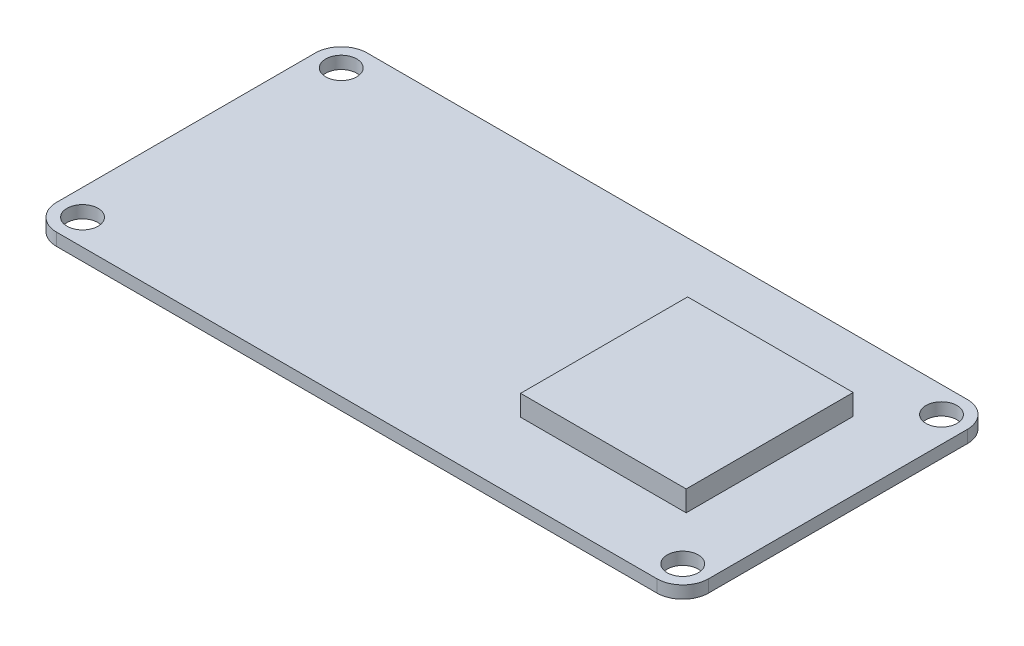
ISO-10303-21;
HEADER;
FILE_DESCRIPTION(('STEP AP214'),'2;1');
FILE_NAME('part.step','',(''),(''),'','','');
FILE_SCHEMA(('AUTOMOTIVE_DESIGN { 1 0 10303 214 1 1 1 1 }'));
ENDSEC;
DATA;
#1=APPLICATION_CONTEXT('core data for automotive mechanical design processes');
#2=APPLICATION_PROTOCOL_DEFINITION('international standard','automotive_design',2000,#1);
#3=PRODUCT_CONTEXT('',#1,'mechanical');
#4=PRODUCT('Part','Part','',(#3));
#5=PRODUCT_RELATED_PRODUCT_CATEGORY('part','',(#4));
#6=PRODUCT_DEFINITION_FORMATION('','',#4);
#7=PRODUCT_DEFINITION_CONTEXT('part definition',#1,'design');
#8=PRODUCT_DEFINITION('design','',#6,#7);
#9=PRODUCT_DEFINITION_SHAPE('','',#8);
#10=(LENGTH_UNIT() NAMED_UNIT(*) SI_UNIT(.MILLI.,.METRE.));
#11=(NAMED_UNIT(*) PLANE_ANGLE_UNIT() SI_UNIT($,.RADIAN.));
#12=(NAMED_UNIT(*) SI_UNIT($,.STERADIAN.) SOLID_ANGLE_UNIT());
#13=UNCERTAINTY_MEASURE_WITH_UNIT(LENGTH_MEASURE(1.E-05),#10,'distance_accuracy_value','');
#14=(GEOMETRIC_REPRESENTATION_CONTEXT(3) GLOBAL_UNCERTAINTY_ASSIGNED_CONTEXT((#13)) GLOBAL_UNIT_ASSIGNED_CONTEXT((#10,
#11,#12)) REPRESENTATION_CONTEXT('',''));
#15=CARTESIAN_POINT('',(0.,0.,0.));
#16=DIRECTION('',(0.,0.,1.));
#17=DIRECTION('',(1.,0.,0.));
#18=AXIS2_PLACEMENT_3D('',#15,#16,#17);
#19=CARTESIAN_POINT('',(0.,1.2,0.));
#20=DIRECTION('',(0.,1.,0.));
#21=DIRECTION('',(0.,0.,1.));
#22=AXIS2_PLACEMENT_3D('',#19,#20,#21);
#23=PLANE('',#22);
#24=DIRECTION('',(0.,0.,1.));
#25=VECTOR('',#24,1.);
#26=CARTESIAN_POINT('',(11.3272410214425,1.2,-6.75742722107556));
#27=LINE('',#26,#25);
#28=CARTESIAN_POINT('',(11.3272410214425,1.2,-6.75742722107556));
#29=VERTEX_POINT('',#28);
#30=CARTESIAN_POINT('',(11.3272410214425,1.2,9.38275914708948));
#31=VERTEX_POINT('',#30);
#32=EDGE_CURVE('E60',#29,#31,#27,.T.);
#33=ORIENTED_EDGE('',*,*,#32,.F.);
#34=DIRECTION('',(-1.,0.,0.));
#35=VECTOR('',#34,1.);
#36=CARTESIAN_POINT('',(11.3272410214425,1.2,-6.75742722107556));
#37=LINE('',#36,#35);
#38=CARTESIAN_POINT('',(27.3272410214425,1.2,-6.75742722107556));
#39=VERTEX_POINT('',#38);
#40=EDGE_CURVE('E64',#39,#29,#37,.T.);
#41=ORIENTED_EDGE('',*,*,#40,.F.);
#42=DIRECTION('',(0.,0.,-1.));
#43=VECTOR('',#42,1.);
#44=CARTESIAN_POINT('',(27.3272410214425,1.2,-6.75742722107556));
#45=LINE('',#44,#43);
#46=CARTESIAN_POINT('',(27.3272410214425,1.2,9.38275914708948));
#47=VERTEX_POINT('',#46);
#48=EDGE_CURVE('E550',#47,#39,#45,.T.);
#49=ORIENTED_EDGE('',*,*,#48,.F.);
#50=DIRECTION('',(1.,0.,0.));
#51=VECTOR('',#50,1.);
#52=CARTESIAN_POINT('',(11.3272410214425,1.2,9.38275914708948));
#53=LINE('',#52,#51);
#54=EDGE_CURVE('E556',#31,#47,#53,.T.);
#55=ORIENTED_EDGE('',*,*,#54,.F.);
#56=EDGE_LOOP('',(#33,#41,#49,#55));
#57=FACE_BOUND('',#56,.T.);
#58=CARTESIAN_POINT('',(31.4272410214425,1.2,13.812665963007));
#59=DIRECTION('',(0.,1.,0.));
#60=DIRECTION('',(0.,0.,1.));
#61=AXIS2_PLACEMENT_3D('',#58,#59,#60);
#62=CIRCLE('',#61,1.5);
#63=CARTESIAN_POINT('',(31.4272410214425,1.2,15.312665963007));
#64=VERTEX_POINT('',#63);
#65=EDGE_CURVE('E165',#64,#64,#62,.T.);
#66=ORIENTED_EDGE('',*,*,#65,.F.);
#67=EDGE_LOOP('',(#66));
#68=FACE_BOUND('',#67,.T.);
#69=CARTESIAN_POINT('',(-26.5727589785575,1.2,-11.187334036993));
#70=DIRECTION('',(0.,1.,0.));
#71=DIRECTION('',(0.,0.,1.));
#72=AXIS2_PLACEMENT_3D('',#69,#70,#71);
#73=CIRCLE('',#72,1.5);
#74=CARTESIAN_POINT('',(-26.5727589785575,1.2,-9.68733403699303));
#75=VERTEX_POINT('',#74);
#76=EDGE_CURVE('E177',#75,#75,#73,.T.);
#77=ORIENTED_EDGE('',*,*,#76,.F.);
#78=EDGE_LOOP('',(#77));
#79=FACE_BOUND('',#78,.T.);
#80=DIRECTION('',(0.,0.,-1.));
#81=VECTOR('',#80,1.);
#82=CARTESIAN_POINT('',(33.9272410214425,1.2,-13.687334036993));
#83=LINE('',#82,#81);
#84=CARTESIAN_POINT('',(33.9272410214425,1.2,13.812665963007));
#85=VERTEX_POINT('',#84);
#86=CARTESIAN_POINT('',(33.9272410214425,1.2,-11.187334036993));
#87=VERTEX_POINT('',#86);
#88=EDGE_CURVE('E190',#85,#87,#83,.T.);
#89=ORIENTED_EDGE('',*,*,#88,.T.);
#90=CARTESIAN_POINT('',(31.4272410214425,1.2,-11.187334036993));
#91=DIRECTION('',(0.,1.,0.));
#92=DIRECTION('',(0.,0.,1.));
#93=AXIS2_PLACEMENT_3D('',#90,#91,#92);
#94=CIRCLE('',#93,2.5);
#95=CARTESIAN_POINT('',(31.4272410214425,1.2,-13.687334036993));
#96=VERTEX_POINT('',#95);
#97=EDGE_CURVE('E230',#87,#96,#94,.T.);
#98=ORIENTED_EDGE('',*,*,#97,.T.);
#99=DIRECTION('',(-1.,0.,0.));
#100=VECTOR('',#99,1.);
#101=CARTESIAN_POINT('',(-29.0727589785575,1.2,-13.687334036993));
#102=LINE('',#101,#100);
#103=CARTESIAN_POINT('',(-26.5727589785575,1.2,-13.687334036993));
#104=VERTEX_POINT('',#103);
#105=EDGE_CURVE('E193',#96,#104,#102,.T.);
#106=ORIENTED_EDGE('',*,*,#105,.T.);
#107=CARTESIAN_POINT('',(-26.5727589785575,1.2,-11.187334036993));
#108=DIRECTION('',(0.,1.,0.));
#109=DIRECTION('',(0.,0.,1.));
#110=AXIS2_PLACEMENT_3D('',#107,#108,#109);
#111=CIRCLE('',#110,2.5);
#112=CARTESIAN_POINT('',(-29.0727589785575,1.2,-11.187334036993));
#113=VERTEX_POINT('',#112);
#114=EDGE_CURVE('E224',#104,#113,#111,.T.);
#115=ORIENTED_EDGE('',*,*,#114,.T.);
#116=DIRECTION('',(0.,0.,1.));
#117=VECTOR('',#116,1.);
#118=CARTESIAN_POINT('',(-29.0727589785575,1.2,-13.687334036993));
#119=LINE('',#118,#117);
#120=CARTESIAN_POINT('',(-29.0727589785575,1.2,13.812665963007));
#121=VERTEX_POINT('',#120);
#122=EDGE_CURVE('E183',#113,#121,#119,.T.);
#123=ORIENTED_EDGE('',*,*,#122,.T.);
#124=CARTESIAN_POINT('',(-26.5727589785575,1.2,13.812665963007));
#125=DIRECTION('',(0.,1.,0.));
#126=DIRECTION('',(0.,0.,1.));
#127=AXIS2_PLACEMENT_3D('',#124,#125,#126);
#128=CIRCLE('',#127,2.5);
#129=CARTESIAN_POINT('',(-26.5727589785575,1.2,16.312665963007));
#130=VERTEX_POINT('',#129);
#131=EDGE_CURVE('E226',#121,#130,#128,.T.);
#132=ORIENTED_EDGE('',*,*,#131,.T.);
#133=DIRECTION('',(1.,0.,0.));
#134=VECTOR('',#133,1.);
#135=CARTESIAN_POINT('',(-29.0727589785575,1.2,16.312665963007));
#136=LINE('',#135,#134);
#137=CARTESIAN_POINT('',(31.4272410214425,1.2,16.312665963007));
#138=VERTEX_POINT('',#137);
#139=EDGE_CURVE('E186',#130,#138,#136,.T.);
#140=ORIENTED_EDGE('',*,*,#139,.T.);
#141=CARTESIAN_POINT('',(31.4272410214425,1.2,13.812665963007));
#142=DIRECTION('',(0.,1.,0.));
#143=DIRECTION('',(0.,0.,1.));
#144=AXIS2_PLACEMENT_3D('',#141,#142,#143);
#145=CIRCLE('',#144,2.5);
#146=EDGE_CURVE('E228',#138,#85,#145,.T.);
#147=ORIENTED_EDGE('',*,*,#146,.T.);
#148=EDGE_LOOP('',(#89,#98,#106,#115,#123,#132,#140,#147));
#149=FACE_BOUND('',#148,.T.);
#150=CARTESIAN_POINT('',(-26.5727589785575,1.2,13.812665963007));
#151=DIRECTION('',(0.,1.,0.));
#152=DIRECTION('',(0.,0.,1.));
#153=AXIS2_PLACEMENT_3D('',#150,#151,#152);
#154=CIRCLE('',#153,1.5);
#155=CARTESIAN_POINT('',(-26.5727589785575,1.2,15.312665963007));
#156=VERTEX_POINT('',#155);
#157=EDGE_CURVE('E171',#156,#156,#154,.T.);
#158=ORIENTED_EDGE('',*,*,#157,.F.);
#159=EDGE_LOOP('',(#158));
#160=FACE_BOUND('',#159,.T.);
#161=CARTESIAN_POINT('',(31.4272410214425,1.2,-11.187334036993));
#162=DIRECTION('',(0.,1.,0.));
#163=DIRECTION('',(0.,0.,1.));
#164=AXIS2_PLACEMENT_3D('',#161,#162,#163);
#165=CIRCLE('',#164,1.5);
#166=CARTESIAN_POINT('',(31.4272410214425,1.2,-9.68733403699303));
#167=VERTEX_POINT('',#166);
#168=EDGE_CURVE('E156',#167,#167,#165,.T.);
#169=ORIENTED_EDGE('',*,*,#168,.F.);
#170=EDGE_LOOP('',(#169));
#171=FACE_BOUND('',#170,.T.);
#172=ADVANCED_FACE('F45',(#57,#68,#79,#149,#160,#171),#23,.T.);
#173=CARTESIAN_POINT('',(0.,0.,0.));
#174=DIRECTION('',(0.,1.,0.));
#175=DIRECTION('',(0.,0.,1.));
#176=AXIS2_PLACEMENT_3D('',#173,#174,#175);
#177=PLANE('',#176);
#178=DIRECTION('',(-1.,0.,0.));
#179=VECTOR('',#178,1.);
#180=CARTESIAN_POINT('',(-29.0727589785575,0.,-13.687334036993));
#181=LINE('',#180,#179);
#182=CARTESIAN_POINT('',(31.4272410214425,0.,-13.687334036993));
#183=VERTEX_POINT('',#182);
#184=CARTESIAN_POINT('',(-26.5727589785575,0.,-13.687334036993));
#185=VERTEX_POINT('',#184);
#186=EDGE_CURVE('E187',#183,#185,#181,.T.);
#187=ORIENTED_EDGE('',*,*,#186,.F.);
#188=CARTESIAN_POINT('',(31.4272410214425,0.,-11.187334036993));
#189=DIRECTION('',(0.,1.,0.));
#190=DIRECTION('',(0.,0.,1.));
#191=AXIS2_PLACEMENT_3D('',#188,#189,#190);
#192=CIRCLE('',#191,2.5);
#193=CARTESIAN_POINT('',(33.9272410214425,0.,-11.187334036993));
#194=VERTEX_POINT('',#193);
#195=EDGE_CURVE('E217',#183,#194,#192,.F.);
#196=ORIENTED_EDGE('',*,*,#195,.T.);
#197=DIRECTION('',(0.,0.,-1.));
#198=VECTOR('',#197,1.);
#199=CARTESIAN_POINT('',(33.9272410214425,0.,-13.687334036993));
#200=LINE('',#199,#198);
#201=CARTESIAN_POINT('',(33.9272410214425,0.,13.812665963007));
#202=VERTEX_POINT('',#201);
#203=EDGE_CURVE('E202',#202,#194,#200,.T.);
#204=ORIENTED_EDGE('',*,*,#203,.F.);
#205=CARTESIAN_POINT('',(31.4272410214425,0.,13.812665963007));
#206=DIRECTION('',(0.,1.,0.));
#207=DIRECTION('',(0.,0.,1.));
#208=AXIS2_PLACEMENT_3D('',#205,#206,#207);
#209=CIRCLE('',#208,2.5);
#210=CARTESIAN_POINT('',(31.4272410214425,0.,16.312665963007));
#211=VERTEX_POINT('',#210);
#212=EDGE_CURVE('E215',#202,#211,#209,.F.);
#213=ORIENTED_EDGE('',*,*,#212,.T.);
#214=DIRECTION('',(1.,0.,0.));
#215=VECTOR('',#214,1.);
#216=CARTESIAN_POINT('',(-29.0727589785575,0.,16.312665963007));
#217=LINE('',#216,#215);
#218=CARTESIAN_POINT('',(-26.5727589785575,0.,16.312665963007));
#219=VERTEX_POINT('',#218);
#220=EDGE_CURVE('E199',#219,#211,#217,.T.);
#221=ORIENTED_EDGE('',*,*,#220,.F.);
#222=CARTESIAN_POINT('',(-26.5727589785575,0.,13.812665963007));
#223=DIRECTION('',(0.,1.,0.));
#224=DIRECTION('',(0.,0.,1.));
#225=AXIS2_PLACEMENT_3D('',#222,#223,#224);
#226=CIRCLE('',#225,2.5);
#227=CARTESIAN_POINT('',(-29.0727589785575,0.,13.812665963007));
#228=VERTEX_POINT('',#227);
#229=EDGE_CURVE('E213',#219,#228,#226,.F.);
#230=ORIENTED_EDGE('',*,*,#229,.T.);
#231=DIRECTION('',(0.,0.,1.));
#232=VECTOR('',#231,1.);
#233=CARTESIAN_POINT('',(-29.0727589785575,0.,-13.687334036993));
#234=LINE('',#233,#232);
#235=CARTESIAN_POINT('',(-29.0727589785575,0.,-11.187334036993));
#236=VERTEX_POINT('',#235);
#237=EDGE_CURVE('E180',#236,#228,#234,.T.);
#238=ORIENTED_EDGE('',*,*,#237,.F.);
#239=CARTESIAN_POINT('',(-26.5727589785575,0.,-11.187334036993));
#240=DIRECTION('',(0.,1.,0.));
#241=DIRECTION('',(0.,0.,1.));
#242=AXIS2_PLACEMENT_3D('',#239,#240,#241);
#243=CIRCLE('',#242,2.5);
#244=EDGE_CURVE('E211',#236,#185,#243,.F.);
#245=ORIENTED_EDGE('',*,*,#244,.T.);
#246=EDGE_LOOP('',(#187,#196,#204,#213,#221,#230,#238,#245));
#247=FACE_BOUND('',#246,.T.);
#248=CARTESIAN_POINT('',(-26.5727589785575,0.,-11.187334036993));
#249=DIRECTION('',(0.,1.,0.));
#250=DIRECTION('',(0.,0.,1.));
#251=AXIS2_PLACEMENT_3D('',#248,#249,#250);
#252=CIRCLE('',#251,1.5);
#253=CARTESIAN_POINT('',(-26.5727589785575,0.,-9.68733403699303));
#254=VERTEX_POINT('',#253);
#255=EDGE_CURVE('E174',#254,#254,#252,.T.);
#256=ORIENTED_EDGE('',*,*,#255,.T.);
#257=EDGE_LOOP('',(#256));
#258=FACE_BOUND('',#257,.T.);
#259=CARTESIAN_POINT('',(-26.5727589785575,0.,13.812665963007));
#260=DIRECTION('',(0.,1.,0.));
#261=DIRECTION('',(0.,0.,1.));
#262=AXIS2_PLACEMENT_3D('',#259,#260,#261);
#263=CIRCLE('',#262,1.5);
#264=CARTESIAN_POINT('',(-26.5727589785575,0.,15.312665963007));
#265=VERTEX_POINT('',#264);
#266=EDGE_CURVE('E168',#265,#265,#263,.T.);
#267=ORIENTED_EDGE('',*,*,#266,.T.);
#268=EDGE_LOOP('',(#267));
#269=FACE_BOUND('',#268,.T.);
#270=CARTESIAN_POINT('',(31.4272410214425,0.,13.812665963007));
#271=DIRECTION('',(0.,1.,0.));
#272=DIRECTION('',(0.,0.,1.));
#273=AXIS2_PLACEMENT_3D('',#270,#271,#272);
#274=CIRCLE('',#273,1.5);
#275=CARTESIAN_POINT('',(31.4272410214425,0.,15.312665963007));
#276=VERTEX_POINT('',#275);
#277=EDGE_CURVE('E163',#276,#276,#274,.T.);
#278=ORIENTED_EDGE('',*,*,#277,.T.);
#279=EDGE_LOOP('',(#278));
#280=FACE_BOUND('',#279,.T.);
#281=CARTESIAN_POINT('',(31.4272410214425,0.,-11.187334036993));
#282=DIRECTION('',(0.,1.,0.));
#283=DIRECTION('',(0.,0.,1.));
#284=AXIS2_PLACEMENT_3D('',#281,#282,#283);
#285=CIRCLE('',#284,1.5);
#286=CARTESIAN_POINT('',(31.4272410214425,0.,-9.68733403699303));
#287=VERTEX_POINT('',#286);
#288=EDGE_CURVE('E153',#287,#287,#285,.T.);
#289=ORIENTED_EDGE('',*,*,#288,.T.);
#290=EDGE_LOOP('',(#289));
#291=FACE_BOUND('',#290,.T.);
#292=ADVANCED_FACE('F247',(#247,#258,#269,#280,#291),#177,.F.);
#293=CARTESIAN_POINT('',(-29.0727589785575,1.2,-13.687334036993));
#294=DIRECTION('',(1.,0.,0.));
#295=DIRECTION('',(0.,0.,-1.));
#296=AXIS2_PLACEMENT_3D('',#293,#294,#295);
#297=PLANE('',#296);
#298=ORIENTED_EDGE('',*,*,#237,.T.);
#299=DIRECTION('',(0.,-1.,0.));
#300=VECTOR('',#299,1.);
#301=CARTESIAN_POINT('',(-29.0727589785575,1.2,13.812665963007));
#302=LINE('',#301,#300);
#303=EDGE_CURVE('E11',#228,#121,#302,.F.);
#304=ORIENTED_EDGE('',*,*,#303,.T.);
#305=ORIENTED_EDGE('',*,*,#122,.F.);
#306=DIRECTION('',(0.,-1.,0.));
#307=VECTOR('',#306,1.);
#308=CARTESIAN_POINT('',(-29.0727589785575,1.2,-11.187334036993));
#309=LINE('',#308,#307);
#310=EDGE_CURVE('E53',#113,#236,#309,.T.);
#311=ORIENTED_EDGE('',*,*,#310,.T.);
#312=EDGE_LOOP('',(#298,#304,#305,#311));
#313=FACE_BOUND('',#312,.T.);
#314=ADVANCED_FACE('F241',(#313),#297,.F.);
#315=CARTESIAN_POINT('',(-29.0727589785575,1.2,16.312665963007));
#316=DIRECTION('',(0.,0.,-1.));
#317=DIRECTION('',(-1.,0.,0.));
#318=AXIS2_PLACEMENT_3D('',#315,#316,#317);
#319=PLANE('',#318);
#320=ORIENTED_EDGE('',*,*,#220,.T.);
#321=DIRECTION('',(0.,-1.,0.));
#322=VECTOR('',#321,1.);
#323=CARTESIAN_POINT('',(31.4272410214425,1.2,16.312665963007));
#324=LINE('',#323,#322);
#325=EDGE_CURVE('E235',#211,#138,#324,.F.);
#326=ORIENTED_EDGE('',*,*,#325,.T.);
#327=ORIENTED_EDGE('',*,*,#139,.F.);
#328=DIRECTION('',(0.,-1.,0.));
#329=VECTOR('',#328,1.);
#330=CARTESIAN_POINT('',(-26.5727589785575,1.2,16.312665963007));
#331=LINE('',#330,#329);
#332=EDGE_CURVE('E232',#130,#219,#331,.T.);
#333=ORIENTED_EDGE('',*,*,#332,.T.);
#334=EDGE_LOOP('',(#320,#326,#327,#333));
#335=FACE_BOUND('',#334,.T.);
#336=ADVANCED_FACE('F256',(#335),#319,.F.);
#337=CARTESIAN_POINT('',(33.9272410214425,1.2,-13.687334036993));
#338=DIRECTION('',(-1.,0.,0.));
#339=DIRECTION('',(0.,0.,1.));
#340=AXIS2_PLACEMENT_3D('',#337,#338,#339);
#341=PLANE('',#340);
#342=ORIENTED_EDGE('',*,*,#203,.T.);
#343=DIRECTION('',(0.,-1.,0.));
#344=VECTOR('',#343,1.);
#345=CARTESIAN_POINT('',(33.9272410214425,1.2,-11.187334036993));
#346=LINE('',#345,#344);
#347=EDGE_CURVE('E222',#194,#87,#346,.F.);
#348=ORIENTED_EDGE('',*,*,#347,.T.);
#349=ORIENTED_EDGE('',*,*,#88,.F.);
#350=DIRECTION('',(0.,-1.,0.));
#351=VECTOR('',#350,1.);
#352=CARTESIAN_POINT('',(33.9272410214425,1.2,13.812665963007));
#353=LINE('',#352,#351);
#354=EDGE_CURVE('E219',#85,#202,#353,.T.);
#355=ORIENTED_EDGE('',*,*,#354,.T.);
#356=EDGE_LOOP('',(#342,#348,#349,#355));
#357=FACE_BOUND('',#356,.T.);
#358=ADVANCED_FACE('F267',(#357),#341,.F.);
#359=CARTESIAN_POINT('',(-29.0727589785575,1.2,-13.687334036993));
#360=DIRECTION('',(0.,0.,1.));
#361=DIRECTION('',(1.,0.,0.));
#362=AXIS2_PLACEMENT_3D('',#359,#360,#361);
#363=PLANE('',#362);
#364=ORIENTED_EDGE('',*,*,#105,.F.);
#365=DIRECTION('',(0.,-1.,0.));
#366=VECTOR('',#365,1.);
#367=CARTESIAN_POINT('',(31.4272410214425,1.2,-13.687334036993));
#368=LINE('',#367,#366);
#369=EDGE_CURVE('E208',#96,#183,#368,.T.);
#370=ORIENTED_EDGE('',*,*,#369,.T.);
#371=ORIENTED_EDGE('',*,*,#186,.T.);
#372=DIRECTION('',(0.,-1.,0.));
#373=VECTOR('',#372,1.);
#374=CARTESIAN_POINT('',(-26.5727589785575,1.2,-13.687334036993));
#375=LINE('',#374,#373);
#376=EDGE_CURVE('E196',#185,#104,#375,.F.);
#377=ORIENTED_EDGE('',*,*,#376,.T.);
#378=EDGE_LOOP('',(#364,#370,#371,#377));
#379=FACE_BOUND('',#378,.T.);
#380=ADVANCED_FACE('F275',(#379),#363,.F.);
#381=CARTESIAN_POINT('',(-26.5727589785575,1.2,-11.187334036993));
#382=DIRECTION('',(0.,-1.,0.));
#383=DIRECTION('',(0.,0.,-1.));
#384=AXIS2_PLACEMENT_3D('',#381,#382,#383);
#385=CYLINDRICAL_SURFACE('',#384,1.5);
#386=ORIENTED_EDGE('',*,*,#76,.T.);
#387=EDGE_LOOP('',(#386));
#388=FACE_BOUND('',#387,.T.);
#389=ORIENTED_EDGE('',*,*,#255,.F.);
#390=EDGE_LOOP('',(#389));
#391=FACE_BOUND('',#390,.T.);
#392=ADVANCED_FACE('F291',(#388,#391),#385,.F.);
#393=CARTESIAN_POINT('',(-26.5727589785575,1.2,13.812665963007));
#394=DIRECTION('',(0.,-1.,0.));
#395=DIRECTION('',(0.,0.,-1.));
#396=AXIS2_PLACEMENT_3D('',#393,#394,#395);
#397=CYLINDRICAL_SURFACE('',#396,1.5);
#398=ORIENTED_EDGE('',*,*,#157,.T.);
#399=EDGE_LOOP('',(#398));
#400=FACE_BOUND('',#399,.T.);
#401=ORIENTED_EDGE('',*,*,#266,.F.);
#402=EDGE_LOOP('',(#401));
#403=FACE_BOUND('',#402,.T.);
#404=ADVANCED_FACE('F481',(#400,#403),#397,.F.);
#405=CARTESIAN_POINT('',(31.4272410214425,1.2,13.812665963007));
#406=DIRECTION('',(0.,-1.,0.));
#407=DIRECTION('',(0.,0.,-1.));
#408=AXIS2_PLACEMENT_3D('',#405,#406,#407);
#409=CYLINDRICAL_SURFACE('',#408,1.5);
#410=ORIENTED_EDGE('',*,*,#65,.T.);
#411=EDGE_LOOP('',(#410));
#412=FACE_BOUND('',#411,.T.);
#413=ORIENTED_EDGE('',*,*,#277,.F.);
#414=EDGE_LOOP('',(#413));
#415=FACE_BOUND('',#414,.T.);
#416=ADVANCED_FACE('F472',(#412,#415),#409,.F.);
#417=CARTESIAN_POINT('',(31.4272410214425,1.2,-11.187334036993));
#418=DIRECTION('',(0.,-1.,0.));
#419=DIRECTION('',(0.,0.,-1.));
#420=AXIS2_PLACEMENT_3D('',#417,#418,#419);
#421=CYLINDRICAL_SURFACE('',#420,1.5);
#422=ORIENTED_EDGE('',*,*,#168,.T.);
#423=EDGE_LOOP('',(#422));
#424=FACE_BOUND('',#423,.T.);
#425=ORIENTED_EDGE('',*,*,#288,.F.);
#426=EDGE_LOOP('',(#425));
#427=FACE_BOUND('',#426,.T.);
#428=ADVANCED_FACE('F304',(#424,#427),#421,.F.);
#429=CARTESIAN_POINT('',(31.4272410214425,1.2,-11.187334036993));
#430=DIRECTION('',(0.,-1.,0.));
#431=DIRECTION('',(0.,0.,-1.));
#432=AXIS2_PLACEMENT_3D('',#429,#430,#431);
#433=CYLINDRICAL_SURFACE('',#432,2.5);
#434=ORIENTED_EDGE('',*,*,#97,.F.);
#435=ORIENTED_EDGE('',*,*,#347,.F.);
#436=ORIENTED_EDGE('',*,*,#195,.F.);
#437=ORIENTED_EDGE('',*,*,#369,.F.);
#438=EDGE_LOOP('',(#434,#435,#436,#437));
#439=FACE_BOUND('',#438,.T.);
#440=ADVANCED_FACE('F272',(#439),#433,.T.);
#441=CARTESIAN_POINT('',(31.4272410214425,1.2,13.812665963007));
#442=DIRECTION('',(0.,-1.,0.));
#443=DIRECTION('',(0.,0.,-1.));
#444=AXIS2_PLACEMENT_3D('',#441,#442,#443);
#445=CYLINDRICAL_SURFACE('',#444,2.5);
#446=ORIENTED_EDGE('',*,*,#146,.F.);
#447=ORIENTED_EDGE('',*,*,#325,.F.);
#448=ORIENTED_EDGE('',*,*,#212,.F.);
#449=ORIENTED_EDGE('',*,*,#354,.F.);
#450=EDGE_LOOP('',(#446,#447,#448,#449));
#451=FACE_BOUND('',#450,.T.);
#452=ADVANCED_FACE('F264',(#451),#445,.T.);
#453=CARTESIAN_POINT('',(-26.5727589785575,1.2,13.812665963007));
#454=DIRECTION('',(0.,-1.,0.));
#455=DIRECTION('',(0.,0.,-1.));
#456=AXIS2_PLACEMENT_3D('',#453,#454,#455);
#457=CYLINDRICAL_SURFACE('',#456,2.5);
#458=ORIENTED_EDGE('',*,*,#131,.F.);
#459=ORIENTED_EDGE('',*,*,#303,.F.);
#460=ORIENTED_EDGE('',*,*,#229,.F.);
#461=ORIENTED_EDGE('',*,*,#332,.F.);
#462=EDGE_LOOP('',(#458,#459,#460,#461));
#463=FACE_BOUND('',#462,.T.);
#464=ADVANCED_FACE('F253',(#463),#457,.T.);
#465=CARTESIAN_POINT('',(-26.5727589785575,1.2,-11.187334036993));
#466=DIRECTION('',(0.,-1.,0.));
#467=DIRECTION('',(0.,0.,-1.));
#468=AXIS2_PLACEMENT_3D('',#465,#466,#467);
#469=CYLINDRICAL_SURFACE('',#468,2.5);
#470=ORIENTED_EDGE('',*,*,#114,.F.);
#471=ORIENTED_EDGE('',*,*,#376,.F.);
#472=ORIENTED_EDGE('',*,*,#244,.F.);
#473=ORIENTED_EDGE('',*,*,#310,.F.);
#474=EDGE_LOOP('',(#470,#471,#472,#473));
#475=FACE_BOUND('',#474,.T.);
#476=ADVANCED_FACE('F47',(#475),#469,.T.);
#477=CARTESIAN_POINT('',(11.3272410214425,3.2,-6.75742722107556));
#478=DIRECTION('',(1.,0.,0.));
#479=DIRECTION('',(0.,0.,-1.));
#480=AXIS2_PLACEMENT_3D('',#477,#478,#479);
#481=PLANE('',#480);
#482=ORIENTED_EDGE('',*,*,#32,.T.);
#483=DIRECTION('',(0.,-1.,0.));
#484=VECTOR('',#483,1.);
#485=CARTESIAN_POINT('',(11.3272410214425,3.2,9.38275914708948));
#486=LINE('',#485,#484);
#487=CARTESIAN_POINT('',(11.3272410214425,3.2,9.38275914708948));
#488=VERTEX_POINT('',#487);
#489=EDGE_CURVE('E136',#488,#31,#486,.T.);
#490=ORIENTED_EDGE('',*,*,#489,.F.);
#491=DIRECTION('',(0.,0.,1.));
#492=VECTOR('',#491,1.);
#493=CARTESIAN_POINT('',(11.3272410214425,3.2,-6.75742722107556));
#494=LINE('',#493,#492);
#495=CARTESIAN_POINT('',(11.3272410214425,3.2,-6.75742722107556));
#496=VERTEX_POINT('',#495);
#497=EDGE_CURVE('E142',#496,#488,#494,.T.);
#498=ORIENTED_EDGE('',*,*,#497,.F.);
#499=DIRECTION('',(0.,-1.,0.));
#500=VECTOR('',#499,1.);
#501=CARTESIAN_POINT('',(11.3272410214425,3.2,-6.75742722107556));
#502=LINE('',#501,#500);
#503=EDGE_CURVE('E548',#496,#29,#502,.T.);
#504=ORIENTED_EDGE('',*,*,#503,.T.);
#505=EDGE_LOOP('',(#482,#490,#498,#504));
#506=FACE_BOUND('',#505,.T.);
#507=ADVANCED_FACE('F152',(#506),#481,.F.);
#508=CARTESIAN_POINT('',(11.3272410214425,3.2,9.38275914708948));
#509=DIRECTION('',(0.,0.,-1.));
#510=DIRECTION('',(-1.,0.,0.));
#511=AXIS2_PLACEMENT_3D('',#508,#509,#510);
#512=PLANE('',#511);
#513=ORIENTED_EDGE('',*,*,#54,.T.);
#514=DIRECTION('',(0.,-1.,0.));
#515=VECTOR('',#514,1.);
#516=CARTESIAN_POINT('',(27.3272410214425,3.2,9.38275914708948));
#517=LINE('',#516,#515);
#518=CARTESIAN_POINT('',(27.3272410214425,3.2,9.38275914708948));
#519=VERTEX_POINT('',#518);
#520=EDGE_CURVE('E138',#519,#47,#517,.T.);
#521=ORIENTED_EDGE('',*,*,#520,.F.);
#522=DIRECTION('',(1.,0.,0.));
#523=VECTOR('',#522,1.);
#524=CARTESIAN_POINT('',(11.3272410214425,3.2,9.38275914708948));
#525=LINE('',#524,#523);
#526=EDGE_CURVE('E131',#488,#519,#525,.T.);
#527=ORIENTED_EDGE('',*,*,#526,.F.);
#528=ORIENTED_EDGE('',*,*,#489,.T.);
#529=EDGE_LOOP('',(#513,#521,#527,#528));
#530=FACE_BOUND('',#529,.T.);
#531=ADVANCED_FACE('F134',(#530),#512,.F.);
#532=CARTESIAN_POINT('',(27.3272410214425,3.2,-6.75742722107556));
#533=DIRECTION('',(-1.,0.,0.));
#534=DIRECTION('',(0.,0.,1.));
#535=AXIS2_PLACEMENT_3D('',#532,#533,#534);
#536=PLANE('',#535);
#537=ORIENTED_EDGE('',*,*,#48,.T.);
#538=DIRECTION('',(0.,-1.,0.));
#539=VECTOR('',#538,1.);
#540=CARTESIAN_POINT('',(27.3272410214425,3.2,-6.75742722107556));
#541=LINE('',#540,#539);
#542=CARTESIAN_POINT('',(27.3272410214425,3.2,-6.75742722107556));
#543=VERTEX_POINT('',#542);
#544=EDGE_CURVE('E158',#543,#39,#541,.T.);
#545=ORIENTED_EDGE('',*,*,#544,.F.);
#546=DIRECTION('',(0.,0.,-1.));
#547=VECTOR('',#546,1.);
#548=CARTESIAN_POINT('',(27.3272410214425,3.2,-6.75742722107556));
#549=LINE('',#548,#547);
#550=EDGE_CURVE('E141',#519,#543,#549,.T.);
#551=ORIENTED_EDGE('',*,*,#550,.F.);
#552=ORIENTED_EDGE('',*,*,#520,.T.);
#553=EDGE_LOOP('',(#537,#545,#551,#552));
#554=FACE_BOUND('',#553,.T.);
#555=ADVANCED_FACE('F337',(#554),#536,.F.);
#556=CARTESIAN_POINT('',(11.3272410214425,3.2,-6.75742722107556));
#557=DIRECTION('',(0.,0.,1.));
#558=DIRECTION('',(1.,0.,0.));
#559=AXIS2_PLACEMENT_3D('',#556,#557,#558);
#560=PLANE('',#559);
#561=ORIENTED_EDGE('',*,*,#40,.T.);
#562=ORIENTED_EDGE('',*,*,#503,.F.);
#563=DIRECTION('',(-1.,0.,0.));
#564=VECTOR('',#563,1.);
#565=CARTESIAN_POINT('',(11.3272410214425,3.2,-6.75742722107556));
#566=LINE('',#565,#564);
#567=EDGE_CURVE('E147',#543,#496,#566,.T.);
#568=ORIENTED_EDGE('',*,*,#567,.F.);
#569=ORIENTED_EDGE('',*,*,#544,.T.);
#570=EDGE_LOOP('',(#561,#562,#568,#569));
#571=FACE_BOUND('',#570,.T.);
#572=ADVANCED_FACE('F346',(#571),#560,.F.);
#573=CARTESIAN_POINT('',(0.,3.2,0.));
#574=DIRECTION('',(0.,1.,0.));
#575=DIRECTION('',(0.,0.,1.));
#576=AXIS2_PLACEMENT_3D('',#573,#574,#575);
#577=PLANE('',#576);
#578=ORIENTED_EDGE('',*,*,#497,.T.);
#579=ORIENTED_EDGE('',*,*,#526,.T.);
#580=ORIENTED_EDGE('',*,*,#550,.T.);
#581=ORIENTED_EDGE('',*,*,#567,.T.);
#582=EDGE_LOOP('',(#578,#579,#580,#581));
#583=FACE_BOUND('',#582,.T.);
#584=ADVANCED_FACE('F145',(#583),#577,.T.);
#585=CLOSED_SHELL('',(#172,#292,#314,#336,#358,#380,#392,#404,#416,#428,#440,#452,#464,#476,
#507,#531,#555,#572,#584));
#586=MANIFOLD_SOLID_BREP('B2',#585);
#587=ADVANCED_BREP_SHAPE_REPRESENTATION('',(#18,#586),#14);
#588=SHAPE_DEFINITION_REPRESENTATION(#9,#587);
ENDSEC;
END-ISO-10303-21;
